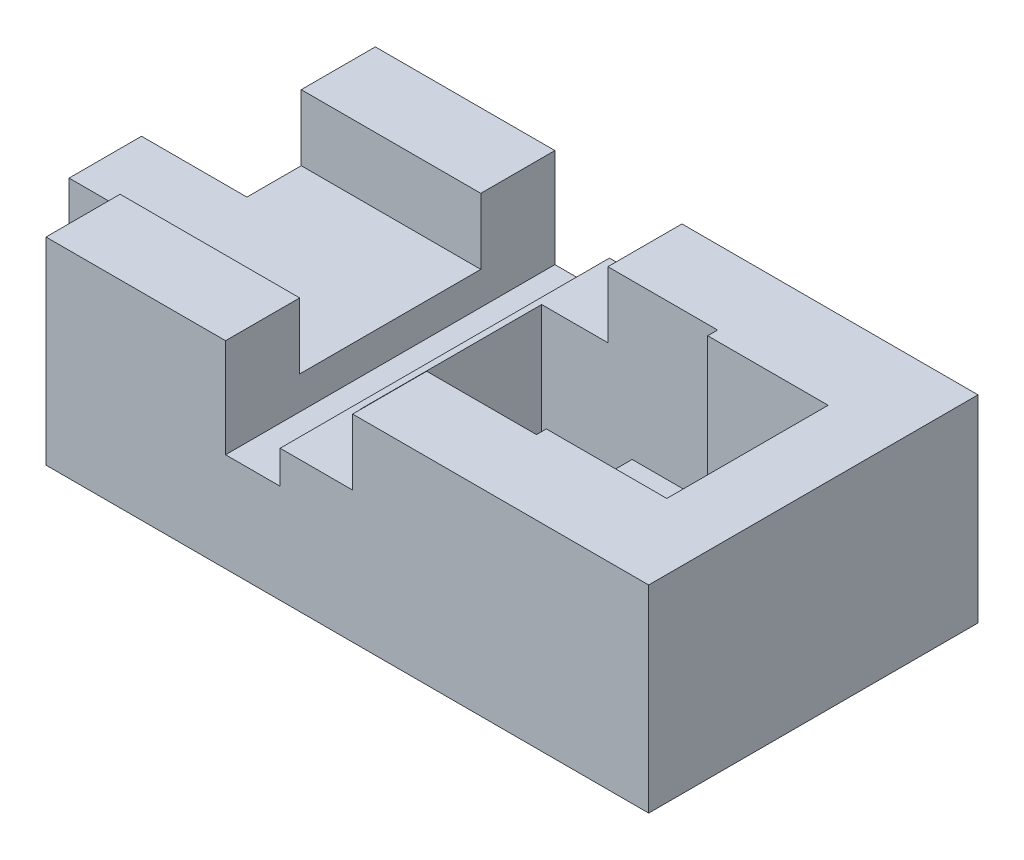
ISO-10303-21;
HEADER;
FILE_DESCRIPTION(('STEP AP214'),'2;1');
FILE_NAME('part.step','',(''),(''),'','','');
FILE_SCHEMA(('AUTOMOTIVE_DESIGN { 1 0 10303 214 1 1 1 1 }'));
ENDSEC;
DATA;
#1=APPLICATION_CONTEXT('core data for automotive mechanical design processes');
#2=APPLICATION_PROTOCOL_DEFINITION('international standard','automotive_design',2000,#1);
#3=PRODUCT_CONTEXT('',#1,'mechanical');
#4=PRODUCT('Part','Part','',(#3));
#5=PRODUCT_RELATED_PRODUCT_CATEGORY('part','',(#4));
#6=PRODUCT_DEFINITION_FORMATION('','',#4);
#7=PRODUCT_DEFINITION_CONTEXT('part definition',#1,'design');
#8=PRODUCT_DEFINITION('design','',#6,#7);
#9=PRODUCT_DEFINITION_SHAPE('','',#8);
#10=(LENGTH_UNIT() NAMED_UNIT(*) SI_UNIT(.MILLI.,.METRE.));
#11=(NAMED_UNIT(*) PLANE_ANGLE_UNIT() SI_UNIT($,.RADIAN.));
#12=(NAMED_UNIT(*) SI_UNIT($,.STERADIAN.) SOLID_ANGLE_UNIT());
#13=UNCERTAINTY_MEASURE_WITH_UNIT(LENGTH_MEASURE(1.E-05),#10,'distance_accuracy_value','');
#14=(GEOMETRIC_REPRESENTATION_CONTEXT(3) GLOBAL_UNCERTAINTY_ASSIGNED_CONTEXT((#13)) GLOBAL_UNIT_ASSIGNED_CONTEXT((#10,
#11,#12)) REPRESENTATION_CONTEXT('',''));
#15=CARTESIAN_POINT('',(0.,0.,0.));
#16=DIRECTION('',(0.,0.,1.));
#17=DIRECTION('',(1.,0.,0.));
#18=AXIS2_PLACEMENT_3D('',#15,#16,#17);
#19=CARTESIAN_POINT('',(0.,4.,0.));
#20=DIRECTION('',(0.,-1.,0.));
#21=DIRECTION('',(0.,0.,-1.));
#22=AXIS2_PLACEMENT_3D('',#19,#20,#21);
#23=PLANE('',#22);
#24=DIRECTION('',(0.,0.,1.));
#25=VECTOR('',#24,1.);
#26=CARTESIAN_POINT('',(-1.09759037141544,4.,0.));
#27=LINE('',#26,#25);
#28=CARTESIAN_POINT('',(-1.09759037141544,4.,-2.75));
#29=VERTEX_POINT('',#28);
#30=CARTESIAN_POINT('',(-1.09759037141544,4.,2.75));
#31=VERTEX_POINT('',#30);
#32=EDGE_CURVE('E308',#29,#31,#27,.T.);
#33=ORIENTED_EDGE('',*,*,#32,.F.);
#34=DIRECTION('',(1.,0.,0.));
#35=VECTOR('',#34,1.);
#36=CARTESIAN_POINT('',(-6.55,4.,-2.75));
#37=LINE('',#36,#35);
#38=CARTESIAN_POINT('',(-6.55,4.,-2.75));
#39=VERTEX_POINT('',#38);
#40=EDGE_CURVE('E330',#39,#29,#37,.T.);
#41=ORIENTED_EDGE('',*,*,#40,.F.);
#42=DIRECTION('',(0.,0.,-1.));
#43=VECTOR('',#42,1.);
#44=CARTESIAN_POINT('',(-6.55,4.,-5.));
#45=LINE('',#44,#43);
#46=CARTESIAN_POINT('',(-6.55,4.,-1.1));
#47=VERTEX_POINT('',#46);
#48=EDGE_CURVE('E528',#47,#39,#45,.T.);
#49=ORIENTED_EDGE('',*,*,#48,.F.);
#50=DIRECTION('',(1.,0.,0.));
#51=VECTOR('',#50,1.);
#52=CARTESIAN_POINT('',(-9.75,4.,-1.1));
#53=LINE('',#52,#51);
#54=CARTESIAN_POINT('',(-9.75,4.,-1.1));
#55=VERTEX_POINT('',#54);
#56=EDGE_CURVE('E533',#55,#47,#53,.T.);
#57=ORIENTED_EDGE('',*,*,#56,.F.);
#58=DIRECTION('',(0.,0.,1.));
#59=VECTOR('',#58,1.);
#60=CARTESIAN_POINT('',(-9.75,4.,5.));
#61=LINE('',#60,#59);
#62=CARTESIAN_POINT('',(-9.75,4.,1.1));
#63=VERTEX_POINT('',#62);
#64=EDGE_CURVE('E602',#55,#63,#61,.T.);
#65=ORIENTED_EDGE('',*,*,#64,.T.);
#66=DIRECTION('',(-1.,0.,0.));
#67=VECTOR('',#66,1.);
#68=CARTESIAN_POINT('',(-9.75,4.,1.1));
#69=LINE('',#68,#67);
#70=CARTESIAN_POINT('',(-6.55,4.,1.1));
#71=VERTEX_POINT('',#70);
#72=EDGE_CURVE('E561',#71,#63,#69,.T.);
#73=ORIENTED_EDGE('',*,*,#72,.F.);
#74=DIRECTION('',(0.,0.,-1.));
#75=VECTOR('',#74,1.);
#76=CARTESIAN_POINT('',(-6.55,4.,5.));
#77=LINE('',#76,#75);
#78=CARTESIAN_POINT('',(-6.55,4.,2.75));
#79=VERTEX_POINT('',#78);
#80=EDGE_CURVE('E537',#79,#71,#77,.T.);
#81=ORIENTED_EDGE('',*,*,#80,.F.);
#82=DIRECTION('',(-1.,0.,0.));
#83=VECTOR('',#82,1.);
#84=CARTESIAN_POINT('',(-6.55,4.,2.75));
#85=LINE('',#84,#83);
#86=EDGE_CURVE('E73',#31,#79,#85,.T.);
#87=ORIENTED_EDGE('',*,*,#86,.F.);
#88=EDGE_LOOP('',(#33,#41,#49,#57,#65,#73,#81,#87));
#89=FACE_BOUND('',#88,.T.);
#90=ADVANCED_FACE('F48',(#89),#23,.F.);
#91=DIRECTION('',(0.,0.,-1.));
#92=VECTOR('',#91,1.);
#93=CARTESIAN_POINT('',(0.558934694694813,4.,0.));
#94=LINE('',#93,#92);
#95=CARTESIAN_POINT('',(0.558934694694813,4.,5.));
#96=VERTEX_POINT('',#95);
#97=CARTESIAN_POINT('',(0.558934694694813,4.,-5.));
#98=VERTEX_POINT('',#97);
#99=EDGE_CURVE('E311',#96,#98,#94,.T.);
#100=ORIENTED_EDGE('',*,*,#99,.F.);
#101=DIRECTION('',(1.,0.,0.));
#102=VECTOR('',#101,1.);
#103=CARTESIAN_POINT('',(-9.75,4.,5.));
#104=LINE('',#103,#102);
#105=CARTESIAN_POINT('',(2.7606994651137,4.,5.));
#106=VERTEX_POINT('',#105);
#107=EDGE_CURVE('E607',#96,#106,#104,.T.);
#108=ORIENTED_EDGE('',*,*,#107,.T.);
#109=DIRECTION('',(0.,0.,1.));
#110=VECTOR('',#109,1.);
#111=CARTESIAN_POINT('',(2.7606994651137,4.,5.));
#112=LINE('',#111,#110);
#113=CARTESIAN_POINT('',(2.7606994651137,4.,2.75));
#114=VERTEX_POINT('',#113);
#115=EDGE_CURVE('E424',#114,#106,#112,.T.);
#116=ORIENTED_EDGE('',*,*,#115,.F.);
#117=DIRECTION('',(1.,0.,0.));
#118=VECTOR('',#117,1.);
#119=CARTESIAN_POINT('',(9.75,4.,2.75));
#120=LINE('',#119,#118);
#121=CARTESIAN_POINT('',(0.750000000000002,4.,2.75));
#122=VERTEX_POINT('',#121);
#123=EDGE_CURVE('E577',#122,#114,#120,.T.);
#124=ORIENTED_EDGE('',*,*,#123,.F.);
#125=DIRECTION('',(0.,0.,1.));
#126=VECTOR('',#125,1.);
#127=CARTESIAN_POINT('',(0.750000000000002,4.,-2.75));
#128=LINE('',#127,#126);
#129=CARTESIAN_POINT('',(0.750000000000002,4.,-2.75));
#130=VERTEX_POINT('',#129);
#131=EDGE_CURVE('E584',#130,#122,#128,.T.);
#132=ORIENTED_EDGE('',*,*,#131,.F.);
#133=DIRECTION('',(-1.,0.,0.));
#134=VECTOR('',#133,1.);
#135=CARTESIAN_POINT('',(9.75,4.,-2.75));
#136=LINE('',#135,#134);
#137=CARTESIAN_POINT('',(2.7606994651137,4.,-2.75));
#138=VERTEX_POINT('',#137);
#139=EDGE_CURVE('E544',#138,#130,#136,.T.);
#140=ORIENTED_EDGE('',*,*,#139,.F.);
#141=DIRECTION('',(0.,0.,1.));
#142=VECTOR('',#141,1.);
#143=CARTESIAN_POINT('',(2.7606994651137,4.,-2.75));
#144=LINE('',#143,#142);
#145=CARTESIAN_POINT('',(2.7606994651137,4.,-5.));
#146=VERTEX_POINT('',#145);
#147=EDGE_CURVE('E430',#146,#138,#144,.T.);
#148=ORIENTED_EDGE('',*,*,#147,.F.);
#149=DIRECTION('',(-1.,0.,0.));
#150=VECTOR('',#149,1.);
#151=CARTESIAN_POINT('',(-9.75,4.,-5.));
#152=LINE('',#151,#150);
#153=EDGE_CURVE('E598',#146,#98,#152,.T.);
#154=ORIENTED_EDGE('',*,*,#153,.T.);
#155=EDGE_LOOP('',(#100,#108,#116,#124,#132,#140,#148,#154));
#156=FACE_BOUND('',#155,.T.);
#157=ADVANCED_FACE('F679',(#156),#23,.F.);
#158=CARTESIAN_POINT('',(-9.75,4.,-5.));
#159=DIRECTION('',(0.,0.,1.));
#160=DIRECTION('',(1.,0.,0.));
#161=AXIS2_PLACEMENT_3D('',#158,#159,#160);
#162=PLANE('',#161);
#163=DIRECTION('',(0.,-1.,0.));
#164=VECTOR('',#163,1.);
#165=CARTESIAN_POINT('',(-1.09759037141544,7.8,-5.));
#166=LINE('',#165,#164);
#167=CARTESIAN_POINT('',(-1.09759037141544,6.,-5.));
#168=VERTEX_POINT('',#167);
#169=CARTESIAN_POINT('',(-1.09759037141544,3.,-5.));
#170=VERTEX_POINT('',#169);
#171=EDGE_CURVE('E65',#168,#170,#166,.T.);
#172=ORIENTED_EDGE('',*,*,#171,.T.);
#173=DIRECTION('',(-1.,0.,0.));
#174=VECTOR('',#173,1.);
#175=CARTESIAN_POINT('',(-1.09759037141544,3.,-5.));
#176=LINE('',#175,#174);
#177=CARTESIAN_POINT('',(0.558934694694813,3.,-5.));
#178=VERTEX_POINT('',#177);
#179=EDGE_CURVE('E286',#178,#170,#176,.T.);
#180=ORIENTED_EDGE('',*,*,#179,.F.);
#181=DIRECTION('',(0.,-1.,0.));
#182=VECTOR('',#181,1.);
#183=CARTESIAN_POINT('',(0.558934694694813,7.8,-5.));
#184=LINE('',#183,#182);
#185=EDGE_CURVE('E302',#98,#178,#184,.T.);
#186=ORIENTED_EDGE('',*,*,#185,.F.);
#187=ORIENTED_EDGE('',*,*,#153,.F.);
#188=DIRECTION('',(0.,-1.,0.));
#189=VECTOR('',#188,1.);
#190=CARTESIAN_POINT('',(2.7606994651137,6.,-5.));
#191=LINE('',#190,#189);
#192=CARTESIAN_POINT('',(2.7606994651137,6.,-5.));
#193=VERTEX_POINT('',#192);
#194=EDGE_CURVE('E464',#193,#146,#191,.T.);
#195=ORIENTED_EDGE('',*,*,#194,.F.);
#196=DIRECTION('',(-1.,0.,0.));
#197=VECTOR('',#196,1.);
#198=CARTESIAN_POINT('',(2.7606994651137,6.,-5.));
#199=LINE('',#198,#197);
#200=CARTESIAN_POINT('',(11.75,6.,-5.));
#201=VERTEX_POINT('',#200);
#202=EDGE_CURVE('E448',#201,#193,#199,.T.);
#203=ORIENTED_EDGE('',*,*,#202,.F.);
#204=DIRECTION('',(0.,1.,0.));
#205=VECTOR('',#204,1.);
#206=CARTESIAN_POINT('',(11.75,0.,-5.));
#207=LINE('',#206,#205);
#208=CARTESIAN_POINT('',(11.75,0.,-5.));
#209=VERTEX_POINT('',#208);
#210=EDGE_CURVE('E484',#209,#201,#207,.T.);
#211=ORIENTED_EDGE('',*,*,#210,.F.);
#212=DIRECTION('',(-1.,0.,0.));
#213=VECTOR('',#212,1.);
#214=CARTESIAN_POINT('',(-9.75,0.,-5.));
#215=LINE('',#214,#213);
#216=CARTESIAN_POINT('',(-6.55,0.,-5.));
#217=VERTEX_POINT('',#216);
#218=EDGE_CURVE('E594',#209,#217,#215,.T.);
#219=ORIENTED_EDGE('',*,*,#218,.T.);
#220=DIRECTION('',(0.,1.,0.));
#221=VECTOR('',#220,1.);
#222=CARTESIAN_POINT('',(-6.55,0.,-5.));
#223=LINE('',#222,#221);
#224=CARTESIAN_POINT('',(-6.55,6.,-5.));
#225=VERTEX_POINT('',#224);
#226=EDGE_CURVE('E541',#217,#225,#223,.T.);
#227=ORIENTED_EDGE('',*,*,#226,.T.);
#228=DIRECTION('',(1.,0.,0.));
#229=VECTOR('',#228,1.);
#230=CARTESIAN_POINT('',(-6.55,6.,-5.));
#231=LINE('',#230,#229);
#232=EDGE_CURVE('E343',#225,#168,#231,.T.);
#233=ORIENTED_EDGE('',*,*,#232,.T.);
#234=EDGE_LOOP('',(#172,#180,#186,#187,#195,#203,#211,#219,#227,#233));
#235=FACE_BOUND('',#234,.T.);
#236=ADVANCED_FACE('F683',(#235),#162,.F.);
#237=CARTESIAN_POINT('',(-9.75,4.,5.));
#238=DIRECTION('',(0.,0.,-1.));
#239=DIRECTION('',(-1.,0.,0.));
#240=AXIS2_PLACEMENT_3D('',#237,#238,#239);
#241=PLANE('',#240);
#242=DIRECTION('',(1.,0.,0.));
#243=VECTOR('',#242,1.);
#244=CARTESIAN_POINT('',(-1.09759037141544,3.,5.));
#245=LINE('',#244,#243);
#246=CARTESIAN_POINT('',(-1.09759037141544,3.,5.));
#247=VERTEX_POINT('',#246);
#248=CARTESIAN_POINT('',(0.558934694694813,3.,5.));
#249=VERTEX_POINT('',#248);
#250=EDGE_CURVE('E283',#247,#249,#245,.T.);
#251=ORIENTED_EDGE('',*,*,#250,.F.);
#252=DIRECTION('',(0.,-1.,0.));
#253=VECTOR('',#252,1.);
#254=CARTESIAN_POINT('',(-1.09759037141544,12.2350932135096,5.));
#255=LINE('',#254,#253);
#256=CARTESIAN_POINT('',(-1.09759037141544,6.,5.));
#257=VERTEX_POINT('',#256);
#258=EDGE_CURVE('E265',#257,#247,#255,.T.);
#259=ORIENTED_EDGE('',*,*,#258,.F.);
#260=DIRECTION('',(-1.,0.,0.));
#261=VECTOR('',#260,1.);
#262=CARTESIAN_POINT('',(-6.55,6.,5.));
#263=LINE('',#262,#261);
#264=CARTESIAN_POINT('',(-6.55,6.,5.));
#265=VERTEX_POINT('',#264);
#266=EDGE_CURVE('E334',#257,#265,#263,.T.);
#267=ORIENTED_EDGE('',*,*,#266,.T.);
#268=DIRECTION('',(0.,1.,0.));
#269=VECTOR('',#268,1.);
#270=CARTESIAN_POINT('',(-6.55,0.,5.));
#271=LINE('',#270,#269);
#272=CARTESIAN_POINT('',(-6.55,0.,5.));
#273=VERTEX_POINT('',#272);
#274=EDGE_CURVE('E550',#273,#265,#271,.T.);
#275=ORIENTED_EDGE('',*,*,#274,.F.);
#276=DIRECTION('',(1.,0.,0.));
#277=VECTOR('',#276,1.);
#278=CARTESIAN_POINT('',(-9.75,0.,5.));
#279=LINE('',#278,#277);
#280=CARTESIAN_POINT('',(11.75,0.,5.));
#281=VERTEX_POINT('',#280);
#282=EDGE_CURVE('E603',#273,#281,#279,.T.);
#283=ORIENTED_EDGE('',*,*,#282,.T.);
#284=DIRECTION('',(0.,-1.,0.));
#285=VECTOR('',#284,1.);
#286=CARTESIAN_POINT('',(11.75,0.,5.));
#287=LINE('',#286,#285);
#288=CARTESIAN_POINT('',(11.75,6.,5.));
#289=VERTEX_POINT('',#288);
#290=EDGE_CURVE('E490',#289,#281,#287,.T.);
#291=ORIENTED_EDGE('',*,*,#290,.F.);
#292=DIRECTION('',(1.,0.,0.));
#293=VECTOR('',#292,1.);
#294=CARTESIAN_POINT('',(11.75,6.,5.));
#295=LINE('',#294,#293);
#296=CARTESIAN_POINT('',(2.7606994651137,6.,5.));
#297=VERTEX_POINT('',#296);
#298=EDGE_CURVE('E440',#297,#289,#295,.T.);
#299=ORIENTED_EDGE('',*,*,#298,.F.);
#300=DIRECTION('',(0.,-1.,0.));
#301=VECTOR('',#300,1.);
#302=CARTESIAN_POINT('',(2.7606994651137,6.,5.));
#303=LINE('',#302,#301);
#304=EDGE_CURVE('E468',#297,#106,#303,.T.);
#305=ORIENTED_EDGE('',*,*,#304,.T.);
#306=ORIENTED_EDGE('',*,*,#107,.F.);
#307=DIRECTION('',(0.,-1.,0.));
#308=VECTOR('',#307,1.);
#309=CARTESIAN_POINT('',(0.558934694694813,7.8,5.));
#310=LINE('',#309,#308);
#311=EDGE_CURVE('E291',#96,#249,#310,.T.);
#312=ORIENTED_EDGE('',*,*,#311,.T.);
#313=EDGE_LOOP('',(#251,#259,#267,#275,#283,#291,#299,#305,#306,#312));
#314=FACE_BOUND('',#313,.T.);
#315=ADVANCED_FACE('F289',(#314),#241,.F.);
#316=CARTESIAN_POINT('',(-6.55,12.2350932135096,-2.75));
#317=DIRECTION('',(0.,0.,-1.));
#318=DIRECTION('',(-1.,0.,0.));
#319=AXIS2_PLACEMENT_3D('',#316,#317,#318);
#320=PLANE('',#319);
#321=DIRECTION('',(0.,-1.,0.));
#322=VECTOR('',#321,1.);
#323=CARTESIAN_POINT('',(-1.09759037141544,12.2350932135096,-2.75));
#324=LINE('',#323,#322);
#325=CARTESIAN_POINT('',(-1.09759037141544,6.,-2.75));
#326=VERTEX_POINT('',#325);
#327=EDGE_CURVE('E312',#326,#29,#324,.T.);
#328=ORIENTED_EDGE('',*,*,#327,.F.);
#329=DIRECTION('',(-1.,0.,0.));
#330=VECTOR('',#329,1.);
#331=CARTESIAN_POINT('',(-6.55,6.,-2.75));
#332=LINE('',#331,#330);
#333=CARTESIAN_POINT('',(-6.55,6.,-2.75));
#334=VERTEX_POINT('',#333);
#335=EDGE_CURVE('E339',#326,#334,#332,.T.);
#336=ORIENTED_EDGE('',*,*,#335,.T.);
#337=DIRECTION('',(0.,-1.,0.));
#338=VECTOR('',#337,1.);
#339=CARTESIAN_POINT('',(-6.55,12.2350932135096,-2.75));
#340=LINE('',#339,#338);
#341=EDGE_CURVE('E351',#334,#39,#340,.T.);
#342=ORIENTED_EDGE('',*,*,#341,.T.);
#343=ORIENTED_EDGE('',*,*,#40,.T.);
#344=EDGE_LOOP('',(#328,#336,#342,#343));
#345=FACE_BOUND('',#344,.T.);
#346=ADVANCED_FACE('F731',(#345),#320,.F.);
#347=CARTESIAN_POINT('',(0.,6.,0.));
#348=DIRECTION('',(0.,-1.,0.));
#349=DIRECTION('',(0.,0.,-1.));
#350=AXIS2_PLACEMENT_3D('',#347,#348,#349);
#351=PLANE('',#350);
#352=DIRECTION('',(0.,0.,1.));
#353=VECTOR('',#352,1.);
#354=CARTESIAN_POINT('',(-1.09759037141544,6.,0.));
#355=LINE('',#354,#353);
#356=EDGE_CURVE('E307',#168,#326,#355,.T.);
#357=ORIENTED_EDGE('',*,*,#356,.F.);
#358=ORIENTED_EDGE('',*,*,#232,.F.);
#359=DIRECTION('',(0.,0.,-1.));
#360=VECTOR('',#359,1.);
#361=CARTESIAN_POINT('',(-6.55,6.,-5.));
#362=LINE('',#361,#360);
#363=EDGE_CURVE('E342',#334,#225,#362,.T.);
#364=ORIENTED_EDGE('',*,*,#363,.F.);
#365=ORIENTED_EDGE('',*,*,#335,.F.);
#366=EDGE_LOOP('',(#357,#358,#364,#365));
#367=FACE_BOUND('',#366,.T.);
#368=ADVANCED_FACE('F750',(#367),#351,.F.);
#369=CARTESIAN_POINT('',(9.75,1.3,2.75));
#370=DIRECTION('',(0.,0.,1.));
#371=DIRECTION('',(1.,0.,0.));
#372=AXIS2_PLACEMENT_3D('',#369,#370,#371);
#373=PLANE('',#372);
#374=DIRECTION('',(-1.,0.,0.));
#375=VECTOR('',#374,1.);
#376=CARTESIAN_POINT('',(2.7606994651137,6.,2.75));
#377=LINE('',#376,#375);
#378=CARTESIAN_POINT('',(6.09259643383098,6.,2.75));
#379=VERTEX_POINT('',#378);
#380=CARTESIAN_POINT('',(2.7606994651137,6.,2.75));
#381=VERTEX_POINT('',#380);
#382=EDGE_CURVE('E434',#379,#381,#377,.T.);
#383=ORIENTED_EDGE('',*,*,#382,.F.);
#384=DIRECTION('',(0.,1.,0.));
#385=VECTOR('',#384,1.);
#386=CARTESIAN_POINT('',(6.09259643383098,0.,2.75));
#387=LINE('',#386,#385);
#388=CARTESIAN_POINT('',(6.09259643383098,1.3,2.75));
#389=VERTEX_POINT('',#388);
#390=EDGE_CURVE('E347',#389,#379,#387,.T.);
#391=ORIENTED_EDGE('',*,*,#390,.F.);
#392=DIRECTION('',(1.,0.,0.));
#393=VECTOR('',#392,1.);
#394=CARTESIAN_POINT('',(9.75,1.3,2.75));
#395=LINE('',#394,#393);
#396=CARTESIAN_POINT('',(3.49790103791758,1.3,2.75));
#397=VERTEX_POINT('',#396);
#398=EDGE_CURVE('E576',#397,#389,#395,.T.);
#399=ORIENTED_EDGE('',*,*,#398,.F.);
#400=DIRECTION('',(0.707106781186547,0.707106781186547,0.));
#401=VECTOR('',#400,1.);
#402=CARTESIAN_POINT('',(6.62395051895879,4.42604948104121,2.75));
#403=LINE('',#402,#401);
#404=CARTESIAN_POINT('',(2.49790103791758,0.299999999999999,2.75));
#405=VERTEX_POINT('',#404);
#406=EDGE_CURVE('E11',#397,#405,#403,.F.);
#407=ORIENTED_EDGE('',*,*,#406,.T.);
#408=DIRECTION('',(0.,1.,0.));
#409=VECTOR('',#408,1.);
#410=CARTESIAN_POINT('',(2.49790103791758,0.,2.75));
#411=LINE('',#410,#409);
#412=CARTESIAN_POINT('',(2.49790103791758,0.,2.75));
#413=VERTEX_POINT('',#412);
#414=EDGE_CURVE('E514',#413,#405,#411,.T.);
#415=ORIENTED_EDGE('',*,*,#414,.F.);
#416=DIRECTION('',(1.,0.,0.));
#417=VECTOR('',#416,1.);
#418=CARTESIAN_POINT('',(0.750000000000003,0.,2.75));
#419=LINE('',#418,#417);
#420=CARTESIAN_POINT('',(0.750000000000003,0.,2.75));
#421=VERTEX_POINT('',#420);
#422=EDGE_CURVE('E502',#421,#413,#419,.T.);
#423=ORIENTED_EDGE('',*,*,#422,.F.);
#424=DIRECTION('',(0.,1.,0.));
#425=VECTOR('',#424,1.);
#426=CARTESIAN_POINT('',(0.750000000000002,1.3,2.75));
#427=LINE('',#426,#425);
#428=EDGE_CURVE('E591',#421,#122,#427,.T.);
#429=ORIENTED_EDGE('',*,*,#428,.T.);
#430=ORIENTED_EDGE('',*,*,#123,.T.);
#431=DIRECTION('',(0.,-1.,0.));
#432=VECTOR('',#431,1.);
#433=CARTESIAN_POINT('',(2.7606994651137,6.,2.75));
#434=LINE('',#433,#432);
#435=EDGE_CURVE('E472',#381,#114,#434,.T.);
#436=ORIENTED_EDGE('',*,*,#435,.F.);
#437=EDGE_LOOP('',(#383,#391,#399,#407,#415,#423,#429,#430,#436));
#438=FACE_BOUND('',#437,.T.);
#439=ADVANCED_FACE('F642',(#438),#373,.F.);
#440=CARTESIAN_POINT('',(9.75,1.3,-2.75));
#441=DIRECTION('',(0.,0.,-1.));
#442=DIRECTION('',(-1.,0.,0.));
#443=AXIS2_PLACEMENT_3D('',#440,#441,#442);
#444=PLANE('',#443);
#445=DIRECTION('',(-1.,0.,0.));
#446=VECTOR('',#445,1.);
#447=CARTESIAN_POINT('',(9.75,1.3,-2.75));
#448=LINE('',#447,#446);
#449=CARTESIAN_POINT('',(6.09259643383098,1.3,-2.75));
#450=VERTEX_POINT('',#449);
#451=CARTESIAN_POINT('',(3.49790103791758,1.3,-2.75));
#452=VERTEX_POINT('',#451);
#453=EDGE_CURVE('E573',#450,#452,#448,.T.);
#454=ORIENTED_EDGE('',*,*,#453,.F.);
#455=DIRECTION('',(0.,1.,0.));
#456=VECTOR('',#455,1.);
#457=CARTESIAN_POINT('',(6.09259643383098,0.,-2.75));
#458=LINE('',#457,#456);
#459=CARTESIAN_POINT('',(6.09259643383098,6.,-2.75));
#460=VERTEX_POINT('',#459);
#461=EDGE_CURVE('E397',#450,#460,#458,.T.);
#462=ORIENTED_EDGE('',*,*,#461,.T.);
#463=DIRECTION('',(1.,0.,0.));
#464=VECTOR('',#463,1.);
#465=CARTESIAN_POINT('',(9.75,6.,-2.75));
#466=LINE('',#465,#464);
#467=CARTESIAN_POINT('',(2.7606994651137,6.,-2.75));
#468=VERTEX_POINT('',#467);
#469=EDGE_CURVE('E425',#468,#460,#466,.T.);
#470=ORIENTED_EDGE('',*,*,#469,.F.);
#471=DIRECTION('',(0.,-1.,0.));
#472=VECTOR('',#471,1.);
#473=CARTESIAN_POINT('',(2.7606994651137,6.,-2.75));
#474=LINE('',#473,#472);
#475=EDGE_CURVE('E454',#468,#138,#474,.T.);
#476=ORIENTED_EDGE('',*,*,#475,.T.);
#477=ORIENTED_EDGE('',*,*,#139,.T.);
#478=DIRECTION('',(0.,1.,0.));
#479=VECTOR('',#478,1.);
#480=CARTESIAN_POINT('',(0.750000000000002,1.3,-2.75));
#481=LINE('',#480,#479);
#482=CARTESIAN_POINT('',(0.750000000000002,0.,-2.75));
#483=VERTEX_POINT('',#482);
#484=EDGE_CURVE('E581',#483,#130,#481,.T.);
#485=ORIENTED_EDGE('',*,*,#484,.F.);
#486=DIRECTION('',(-1.,0.,0.));
#487=VECTOR('',#486,1.);
#488=CARTESIAN_POINT('',(0.750000000000002,0.,-2.75));
#489=LINE('',#488,#487);
#490=CARTESIAN_POINT('',(2.49790103791758,0.,-2.75));
#491=VERTEX_POINT('',#490);
#492=EDGE_CURVE('E510',#491,#483,#489,.T.);
#493=ORIENTED_EDGE('',*,*,#492,.F.);
#494=DIRECTION('',(0.,1.,0.));
#495=VECTOR('',#494,1.);
#496=CARTESIAN_POINT('',(2.49790103791758,0.,-2.75));
#497=LINE('',#496,#495);
#498=CARTESIAN_POINT('',(2.49790103791758,0.299999999999999,-2.75));
#499=VERTEX_POINT('',#498);
#500=EDGE_CURVE('E515',#491,#499,#497,.T.);
#501=ORIENTED_EDGE('',*,*,#500,.T.);
#502=DIRECTION('',(-0.707106781186547,-0.707106781186547,0.));
#503=VECTOR('',#502,1.);
#504=CARTESIAN_POINT('',(6.62395051895879,4.42604948104121,-2.75));
#505=LINE('',#504,#503);
#506=EDGE_CURVE('E58',#499,#452,#505,.F.);
#507=ORIENTED_EDGE('',*,*,#506,.T.);
#508=EDGE_LOOP('',(#454,#462,#470,#476,#477,#485,#493,#501,#507));
#509=FACE_BOUND('',#508,.T.);
#510=ADVANCED_FACE('F631',(#509),#444,.F.);
#511=CARTESIAN_POINT('',(0.,1.3,0.));
#512=DIRECTION('',(0.,-1.,0.));
#513=DIRECTION('',(0.,0.,-1.));
#514=AXIS2_PLACEMENT_3D('',#511,#512,#513);
#515=PLANE('',#514);
#516=ORIENTED_EDGE('',*,*,#398,.T.);
#517=DIRECTION('',(0.,0.,-1.));
#518=VECTOR('',#517,1.);
#519=CARTESIAN_POINT('',(6.09259643383098,1.3,0.));
#520=LINE('',#519,#518);
#521=CARTESIAN_POINT('',(6.09259643383098,1.3,2.45));
#522=VERTEX_POINT('',#521);
#523=EDGE_CURVE('E386',#389,#522,#520,.T.);
#524=ORIENTED_EDGE('',*,*,#523,.T.);
#525=DIRECTION('',(1.,0.,0.));
#526=VECTOR('',#525,1.);
#527=CARTESIAN_POINT('',(0.,1.3,2.45));
#528=LINE('',#527,#526);
#529=CARTESIAN_POINT('',(8.00292213727261,1.3,2.45));
#530=VERTEX_POINT('',#529);
#531=EDGE_CURVE('E382',#522,#530,#528,.T.);
#532=ORIENTED_EDGE('',*,*,#531,.T.);
#533=DIRECTION('',(0.,0.,1.));
#534=VECTOR('',#533,1.);
#535=CARTESIAN_POINT('',(8.00292213727261,1.3,-2.75));
#536=LINE('',#535,#534);
#537=CARTESIAN_POINT('',(8.00292213727261,1.3,-2.45));
#538=VERTEX_POINT('',#537);
#539=EDGE_CURVE('E476',#538,#530,#536,.T.);
#540=ORIENTED_EDGE('',*,*,#539,.F.);
#541=DIRECTION('',(-1.,0.,0.));
#542=VECTOR('',#541,1.);
#543=CARTESIAN_POINT('',(0.,1.3,-2.45));
#544=LINE('',#543,#542);
#545=CARTESIAN_POINT('',(6.09259643383098,1.3,-2.45));
#546=VERTEX_POINT('',#545);
#547=EDGE_CURVE('E420',#538,#546,#544,.T.);
#548=ORIENTED_EDGE('',*,*,#547,.T.);
#549=DIRECTION('',(0.,0.,-1.));
#550=VECTOR('',#549,1.);
#551=CARTESIAN_POINT('',(6.09259643383098,1.3,0.));
#552=LINE('',#551,#550);
#553=EDGE_CURVE('E402',#546,#450,#552,.T.);
#554=ORIENTED_EDGE('',*,*,#553,.T.);
#555=ORIENTED_EDGE('',*,*,#453,.T.);
#556=DIRECTION('',(0.,0.,1.));
#557=VECTOR('',#556,1.);
#558=CARTESIAN_POINT('',(3.49790103791758,1.3,0.));
#559=LINE('',#558,#557);
#560=EDGE_CURVE('E623',#452,#397,#559,.T.);
#561=ORIENTED_EDGE('',*,*,#560,.T.);
#562=EDGE_LOOP('',(#516,#524,#532,#540,#548,#554,#555,#561));
#563=FACE_BOUND('',#562,.T.);
#564=ADVANCED_FACE('F638',(#563),#515,.F.);
#565=CARTESIAN_POINT('',(9.75,0.,0.));
#566=DIRECTION('',(1.,0.,0.));
#567=DIRECTION('',(0.,0.,-1.));
#568=AXIS2_PLACEMENT_3D('',#565,#566,#567);
#569=PLANE('',#568);
#570=DIRECTION('',(0.,0.,-1.));
#571=VECTOR('',#570,1.);
#572=CARTESIAN_POINT('',(9.75,2.8,-2.75));
#573=LINE('',#572,#571);
#574=CARTESIAN_POINT('',(9.75,2.8,2.45));
#575=VERTEX_POINT('',#574);
#576=CARTESIAN_POINT('',(9.75,2.8,-2.45));
#577=VERTEX_POINT('',#576);
#578=EDGE_CURVE('E477',#575,#577,#573,.T.);
#579=ORIENTED_EDGE('',*,*,#578,.F.);
#580=DIRECTION('',(0.,1.,0.));
#581=VECTOR('',#580,1.);
#582=CARTESIAN_POINT('',(9.75,0.,2.45));
#583=LINE('',#582,#581);
#584=CARTESIAN_POINT('',(9.75,6.,2.45));
#585=VERTEX_POINT('',#584);
#586=EDGE_CURVE('E357',#575,#585,#583,.T.);
#587=ORIENTED_EDGE('',*,*,#586,.T.);
#588=DIRECTION('',(0.,0.,1.));
#589=VECTOR('',#588,1.);
#590=CARTESIAN_POINT('',(9.75,6.,2.75));
#591=LINE('',#590,#589);
#592=CARTESIAN_POINT('',(9.75,6.,-2.45));
#593=VERTEX_POINT('',#592);
#594=EDGE_CURVE('E429',#593,#585,#591,.T.);
#595=ORIENTED_EDGE('',*,*,#594,.F.);
#596=DIRECTION('',(0.,1.,0.));
#597=VECTOR('',#596,1.);
#598=CARTESIAN_POINT('',(9.75,0.,-2.45));
#599=LINE('',#598,#597);
#600=EDGE_CURVE('E398',#577,#593,#599,.T.);
#601=ORIENTED_EDGE('',*,*,#600,.F.);
#602=EDGE_LOOP('',(#579,#587,#595,#601));
#603=FACE_BOUND('',#602,.T.);
#604=ADVANCED_FACE('F663',(#603),#569,.F.);
#605=CARTESIAN_POINT('',(-9.75,4.,5.));
#606=DIRECTION('',(1.,0.,0.));
#607=DIRECTION('',(0.,0.,-1.));
#608=AXIS2_PLACEMENT_3D('',#605,#606,#607);
#609=PLANE('',#608);
#610=ORIENTED_EDGE('',*,*,#64,.F.);
#611=DIRECTION('',(0.,1.,0.));
#612=VECTOR('',#611,1.);
#613=CARTESIAN_POINT('',(-9.75,0.,-1.1));
#614=LINE('',#613,#612);
#615=CARTESIAN_POINT('',(-9.75,0.,-1.1));
#616=VERTEX_POINT('',#615);
#617=EDGE_CURVE('E532',#616,#55,#614,.T.);
#618=ORIENTED_EDGE('',*,*,#617,.F.);
#619=DIRECTION('',(0.,0.,1.));
#620=VECTOR('',#619,1.);
#621=CARTESIAN_POINT('',(-9.75,0.,5.));
#622=LINE('',#621,#620);
#623=CARTESIAN_POINT('',(-9.75,0.,1.1));
#624=VERTEX_POINT('',#623);
#625=EDGE_CURVE('E614',#616,#624,#622,.T.);
#626=ORIENTED_EDGE('',*,*,#625,.T.);
#627=DIRECTION('',(0.,1.,0.));
#628=VECTOR('',#627,1.);
#629=CARTESIAN_POINT('',(-9.75,0.,1.1));
#630=LINE('',#629,#628);
#631=EDGE_CURVE('E519',#624,#63,#630,.T.);
#632=ORIENTED_EDGE('',*,*,#631,.T.);
#633=EDGE_LOOP('',(#610,#618,#626,#632));
#634=FACE_BOUND('',#633,.T.);
#635=ADVANCED_FACE('F728',(#634),#609,.F.);
#636=CARTESIAN_POINT('',(0.,0.,0.));
#637=DIRECTION('',(0.,-1.,0.));
#638=DIRECTION('',(0.,0.,-1.));
#639=AXIS2_PLACEMENT_3D('',#636,#637,#638);
#640=PLANE('',#639);
#641=DIRECTION('',(0.,0.,1.));
#642=VECTOR('',#641,1.);
#643=CARTESIAN_POINT('',(0.750000000000002,0.,-2.75));
#644=LINE('',#643,#642);
#645=EDGE_CURVE('E498',#483,#421,#644,.T.);
#646=ORIENTED_EDGE('',*,*,#645,.T.);
#647=ORIENTED_EDGE('',*,*,#422,.T.);
#648=DIRECTION('',(0.,0.,-1.));
#649=VECTOR('',#648,1.);
#650=CARTESIAN_POINT('',(2.49790103791758,0.,-2.75));
#651=LINE('',#650,#649);
#652=EDGE_CURVE('E506',#413,#491,#651,.T.);
#653=ORIENTED_EDGE('',*,*,#652,.T.);
#654=ORIENTED_EDGE('',*,*,#492,.T.);
#655=EDGE_LOOP('',(#646,#647,#653,#654));
#656=FACE_BOUND('',#655,.T.);
#657=DIRECTION('',(0.,0.,-1.));
#658=VECTOR('',#657,1.);
#659=CARTESIAN_POINT('',(-6.55,0.,-5.));
#660=LINE('',#659,#658);
#661=CARTESIAN_POINT('',(-6.55,0.,-1.1));
#662=VERTEX_POINT('',#661);
#663=EDGE_CURVE('E527',#662,#217,#660,.T.);
#664=ORIENTED_EDGE('',*,*,#663,.T.);
#665=ORIENTED_EDGE('',*,*,#218,.F.);
#666=DIRECTION('',(0.,0.,-1.));
#667=VECTOR('',#666,1.);
#668=CARTESIAN_POINT('',(11.75,0.,-5.));
#669=LINE('',#668,#667);
#670=EDGE_CURVE('E494',#281,#209,#669,.T.);
#671=ORIENTED_EDGE('',*,*,#670,.F.);
#672=ORIENTED_EDGE('',*,*,#282,.F.);
#673=DIRECTION('',(0.,0.,-1.));
#674=VECTOR('',#673,1.);
#675=CARTESIAN_POINT('',(-6.55,0.,5.));
#676=LINE('',#675,#674);
#677=CARTESIAN_POINT('',(-6.55,0.,1.1));
#678=VERTEX_POINT('',#677);
#679=EDGE_CURVE('E564',#273,#678,#676,.T.);
#680=ORIENTED_EDGE('',*,*,#679,.T.);
#681=DIRECTION('',(-1.,0.,0.));
#682=VECTOR('',#681,1.);
#683=CARTESIAN_POINT('',(-9.75,0.,1.1));
#684=LINE('',#683,#682);
#685=EDGE_CURVE('E553',#678,#624,#684,.T.);
#686=ORIENTED_EDGE('',*,*,#685,.T.);
#687=ORIENTED_EDGE('',*,*,#625,.F.);
#688=DIRECTION('',(1.,0.,0.));
#689=VECTOR('',#688,1.);
#690=CARTESIAN_POINT('',(-9.75,0.,-1.1));
#691=LINE('',#690,#689);
#692=EDGE_CURVE('E523',#616,#662,#691,.T.);
#693=ORIENTED_EDGE('',*,*,#692,.T.);
#694=EDGE_LOOP('',(#664,#665,#671,#672,#680,#686,#687,#693));
#695=FACE_BOUND('',#694,.T.);
#696=ADVANCED_FACE('F698',(#656,#695),#640,.T.);
#697=CARTESIAN_POINT('',(0.750000000000002,1.3,-2.75));
#698=DIRECTION('',(-1.,0.,0.));
#699=DIRECTION('',(0.,0.,1.));
#700=AXIS2_PLACEMENT_3D('',#697,#698,#699);
#701=PLANE('',#700);
#702=ORIENTED_EDGE('',*,*,#131,.T.);
#703=ORIENTED_EDGE('',*,*,#428,.F.);
#704=ORIENTED_EDGE('',*,*,#645,.F.);
#705=ORIENTED_EDGE('',*,*,#484,.T.);
#706=EDGE_LOOP('',(#702,#703,#704,#705));
#707=FACE_BOUND('',#706,.T.);
#708=ADVANCED_FACE('F696',(#707),#701,.F.);
#709=CARTESIAN_POINT('',(-9.75,0.,1.1));
#710=DIRECTION('',(0.,0.,-1.));
#711=DIRECTION('',(-1.,0.,0.));
#712=AXIS2_PLACEMENT_3D('',#709,#710,#711);
#713=PLANE('',#712);
#714=ORIENTED_EDGE('',*,*,#72,.T.);
#715=ORIENTED_EDGE('',*,*,#631,.F.);
#716=ORIENTED_EDGE('',*,*,#685,.F.);
#717=DIRECTION('',(0.,1.,0.));
#718=VECTOR('',#717,1.);
#719=CARTESIAN_POINT('',(-6.55,0.,1.1));
#720=LINE('',#719,#718);
#721=EDGE_CURVE('E554',#678,#71,#720,.T.);
#722=ORIENTED_EDGE('',*,*,#721,.T.);
#723=EDGE_LOOP('',(#714,#715,#716,#722));
#724=FACE_BOUND('',#723,.T.);
#725=ADVANCED_FACE('F892',(#724),#713,.F.);
#726=CARTESIAN_POINT('',(-6.55,0.,5.));
#727=DIRECTION('',(1.,0.,0.));
#728=DIRECTION('',(0.,0.,-1.));
#729=AXIS2_PLACEMENT_3D('',#726,#727,#728);
#730=PLANE('',#729);
#731=ORIENTED_EDGE('',*,*,#274,.T.);
#732=DIRECTION('',(0.,0.,-1.));
#733=VECTOR('',#732,1.);
#734=CARTESIAN_POINT('',(-6.55,6.,5.));
#735=LINE('',#734,#733);
#736=CARTESIAN_POINT('',(-6.55,6.,2.75));
#737=VERTEX_POINT('',#736);
#738=EDGE_CURVE('E319',#265,#737,#735,.T.);
#739=ORIENTED_EDGE('',*,*,#738,.T.);
#740=DIRECTION('',(0.,-1.,0.));
#741=VECTOR('',#740,1.);
#742=CARTESIAN_POINT('',(-6.55,12.2350932135096,2.75));
#743=LINE('',#742,#741);
#744=EDGE_CURVE('E325',#737,#79,#743,.T.);
#745=ORIENTED_EDGE('',*,*,#744,.T.);
#746=ORIENTED_EDGE('',*,*,#80,.T.);
#747=ORIENTED_EDGE('',*,*,#721,.F.);
#748=ORIENTED_EDGE('',*,*,#679,.F.);
#749=EDGE_LOOP('',(#731,#739,#745,#746,#747,#748));
#750=FACE_BOUND('',#749,.T.);
#751=ADVANCED_FACE('F878',(#750),#730,.F.);
#752=CARTESIAN_POINT('',(-6.55,0.,-5.));
#753=DIRECTION('',(1.,0.,0.));
#754=DIRECTION('',(0.,0.,-1.));
#755=AXIS2_PLACEMENT_3D('',#752,#753,#754);
#756=PLANE('',#755);
#757=ORIENTED_EDGE('',*,*,#48,.T.);
#758=ORIENTED_EDGE('',*,*,#341,.F.);
#759=ORIENTED_EDGE('',*,*,#363,.T.);
#760=ORIENTED_EDGE('',*,*,#226,.F.);
#761=ORIENTED_EDGE('',*,*,#663,.F.);
#762=DIRECTION('',(0.,1.,0.));
#763=VECTOR('',#762,1.);
#764=CARTESIAN_POINT('',(-6.55,0.,-1.1));
#765=LINE('',#764,#763);
#766=EDGE_CURVE('E545',#662,#47,#765,.T.);
#767=ORIENTED_EDGE('',*,*,#766,.T.);
#768=EDGE_LOOP('',(#757,#758,#759,#760,#761,#767));
#769=FACE_BOUND('',#768,.T.);
#770=ADVANCED_FACE('F710',(#769),#756,.F.);
#771=CARTESIAN_POINT('',(-9.75,0.,-1.1));
#772=DIRECTION('',(0.,0.,1.));
#773=DIRECTION('',(1.,0.,0.));
#774=AXIS2_PLACEMENT_3D('',#771,#772,#773);
#775=PLANE('',#774);
#776=ORIENTED_EDGE('',*,*,#56,.T.);
#777=ORIENTED_EDGE('',*,*,#766,.F.);
#778=ORIENTED_EDGE('',*,*,#692,.F.);
#779=ORIENTED_EDGE('',*,*,#617,.T.);
#780=EDGE_LOOP('',(#776,#777,#778,#779));
#781=FACE_BOUND('',#780,.T.);
#782=ADVANCED_FACE('F703',(#781),#775,.F.);
#783=CARTESIAN_POINT('',(2.49790103791758,0.,-2.75));
#784=DIRECTION('',(1.,0.,0.));
#785=DIRECTION('',(0.,0.,-1.));
#786=AXIS2_PLACEMENT_3D('',#783,#784,#785);
#787=PLANE('',#786);
#788=ORIENTED_EDGE('',*,*,#414,.T.);
#789=DIRECTION('',(0.,0.,-1.));
#790=VECTOR('',#789,1.);
#791=CARTESIAN_POINT('',(2.49790103791758,0.299999999999999,-2.75));
#792=LINE('',#791,#790);
#793=EDGE_CURVE('E610',#405,#499,#792,.T.);
#794=ORIENTED_EDGE('',*,*,#793,.T.);
#795=ORIENTED_EDGE('',*,*,#500,.F.);
#796=ORIENTED_EDGE('',*,*,#652,.F.);
#797=EDGE_LOOP('',(#788,#794,#795,#796));
#798=FACE_BOUND('',#797,.T.);
#799=ADVANCED_FACE('F701',(#798),#787,.F.);
#800=CARTESIAN_POINT('',(2.49790103791758,0.299999999999999,-2.75));
#801=DIRECTION('',(0.707106781186547,-0.707106781186547,0.));
#802=DIRECTION('',(0.,0.,-1.));
#803=AXIS2_PLACEMENT_3D('',#800,#801,#802);
#804=PLANE('',#803);
#805=ORIENTED_EDGE('',*,*,#406,.F.);
#806=ORIENTED_EDGE('',*,*,#560,.F.);
#807=ORIENTED_EDGE('',*,*,#506,.F.);
#808=ORIENTED_EDGE('',*,*,#793,.F.);
#809=EDGE_LOOP('',(#805,#806,#807,#808));
#810=FACE_BOUND('',#809,.T.);
#811=ADVANCED_FACE('F51',(#810),#804,.F.);
#812=CARTESIAN_POINT('',(11.75,0.,0.));
#813=DIRECTION('',(1.,0.,0.));
#814=DIRECTION('',(0.,0.,-1.));
#815=AXIS2_PLACEMENT_3D('',#812,#813,#814);
#816=PLANE('',#815);
#817=ORIENTED_EDGE('',*,*,#210,.T.);
#818=DIRECTION('',(0.,0.,-1.));
#819=VECTOR('',#818,1.);
#820=CARTESIAN_POINT('',(11.75,6.,-5.));
#821=LINE('',#820,#819);
#822=EDGE_CURVE('E444',#289,#201,#821,.T.);
#823=ORIENTED_EDGE('',*,*,#822,.F.);
#824=ORIENTED_EDGE('',*,*,#290,.T.);
#825=ORIENTED_EDGE('',*,*,#670,.T.);
#826=EDGE_LOOP('',(#817,#823,#824,#825));
#827=FACE_BOUND('',#826,.T.);
#828=ADVANCED_FACE('F709',(#827),#816,.T.);
#829=CARTESIAN_POINT('',(8.00292213727261,2.8,-2.75));
#830=DIRECTION('',(1.,0.,0.));
#831=DIRECTION('',(0.,0.,-1.));
#832=AXIS2_PLACEMENT_3D('',#829,#830,#831);
#833=PLANE('',#832);
#834=ORIENTED_EDGE('',*,*,#539,.T.);
#835=DIRECTION('',(0.,1.,0.));
#836=VECTOR('',#835,1.);
#837=CARTESIAN_POINT('',(8.00292213727261,2.8,2.45));
#838=LINE('',#837,#836);
#839=CARTESIAN_POINT('',(8.00292213727261,2.8,2.45));
#840=VERTEX_POINT('',#839);
#841=EDGE_CURVE('E378',#530,#840,#838,.T.);
#842=ORIENTED_EDGE('',*,*,#841,.T.);
#843=DIRECTION('',(0.,0.,1.));
#844=VECTOR('',#843,1.);
#845=CARTESIAN_POINT('',(8.00292213727261,2.8,-2.75));
#846=LINE('',#845,#844);
#847=CARTESIAN_POINT('',(8.00292213727261,2.8,-2.45));
#848=VERTEX_POINT('',#847);
#849=EDGE_CURVE('E480',#848,#840,#846,.T.);
#850=ORIENTED_EDGE('',*,*,#849,.F.);
#851=DIRECTION('',(0.,-1.,0.));
#852=VECTOR('',#851,1.);
#853=CARTESIAN_POINT('',(8.00292213727261,2.8,-2.45));
#854=LINE('',#853,#852);
#855=EDGE_CURVE('E416',#848,#538,#854,.T.);
#856=ORIENTED_EDGE('',*,*,#855,.T.);
#857=EDGE_LOOP('',(#834,#842,#850,#856));
#858=FACE_BOUND('',#857,.T.);
#859=ADVANCED_FACE('F652',(#858),#833,.F.);
#860=CARTESIAN_POINT('',(0.,2.8,0.));
#861=DIRECTION('',(0.,-1.,0.));
#862=DIRECTION('',(0.,0.,-1.));
#863=AXIS2_PLACEMENT_3D('',#860,#861,#862);
#864=PLANE('',#863);
#865=ORIENTED_EDGE('',*,*,#849,.T.);
#866=DIRECTION('',(1.,0.,0.));
#867=VECTOR('',#866,1.);
#868=CARTESIAN_POINT('',(0.,2.8,2.45));
#869=LINE('',#868,#867);
#870=EDGE_CURVE('E374',#840,#575,#869,.T.);
#871=ORIENTED_EDGE('',*,*,#870,.T.);
#872=ORIENTED_EDGE('',*,*,#578,.T.);
#873=DIRECTION('',(-1.,0.,0.));
#874=VECTOR('',#873,1.);
#875=CARTESIAN_POINT('',(0.,2.8,-2.45));
#876=LINE('',#875,#874);
#877=EDGE_CURVE('E412',#577,#848,#876,.T.);
#878=ORIENTED_EDGE('',*,*,#877,.T.);
#879=EDGE_LOOP('',(#865,#871,#872,#878));
#880=FACE_BOUND('',#879,.T.);
#881=ADVANCED_FACE('F660',(#880),#864,.F.);
#882=CARTESIAN_POINT('',(2.7606994651137,6.,5.));
#883=DIRECTION('',(1.,0.,0.));
#884=DIRECTION('',(0.,0.,-1.));
#885=AXIS2_PLACEMENT_3D('',#882,#883,#884);
#886=PLANE('',#885);
#887=ORIENTED_EDGE('',*,*,#115,.T.);
#888=ORIENTED_EDGE('',*,*,#304,.F.);
#889=DIRECTION('',(0.,0.,1.));
#890=VECTOR('',#889,1.);
#891=CARTESIAN_POINT('',(2.7606994651137,6.,5.));
#892=LINE('',#891,#890);
#893=EDGE_CURVE('E437',#381,#297,#892,.T.);
#894=ORIENTED_EDGE('',*,*,#893,.F.);
#895=ORIENTED_EDGE('',*,*,#435,.T.);
#896=EDGE_LOOP('',(#887,#888,#894,#895));
#897=FACE_BOUND('',#896,.T.);
#898=ADVANCED_FACE('F691',(#897),#886,.F.);
#899=CARTESIAN_POINT('',(2.7606994651137,6.,-2.75));
#900=DIRECTION('',(1.,0.,0.));
#901=DIRECTION('',(0.,0.,-1.));
#902=AXIS2_PLACEMENT_3D('',#899,#900,#901);
#903=PLANE('',#902);
#904=ORIENTED_EDGE('',*,*,#147,.T.);
#905=ORIENTED_EDGE('',*,*,#475,.F.);
#906=DIRECTION('',(0.,0.,1.));
#907=VECTOR('',#906,1.);
#908=CARTESIAN_POINT('',(2.7606994651137,6.,-2.75));
#909=LINE('',#908,#907);
#910=EDGE_CURVE('E451',#193,#468,#909,.T.);
#911=ORIENTED_EDGE('',*,*,#910,.F.);
#912=ORIENTED_EDGE('',*,*,#194,.T.);
#913=EDGE_LOOP('',(#904,#905,#911,#912));
#914=FACE_BOUND('',#913,.T.);
#915=ADVANCED_FACE('F674',(#914),#903,.F.);
#916=CARTESIAN_POINT('',(0.,6.,0.));
#917=DIRECTION('',(0.,-1.,0.));
#918=DIRECTION('',(0.,0.,-1.));
#919=AXIS2_PLACEMENT_3D('',#916,#917,#918);
#920=PLANE('',#919);
#921=ORIENTED_EDGE('',*,*,#594,.T.);
#922=DIRECTION('',(-1.,0.,0.));
#923=VECTOR('',#922,1.);
#924=CARTESIAN_POINT('',(6.09259643383098,6.,2.45));
#925=LINE('',#924,#923);
#926=CARTESIAN_POINT('',(6.09259643383098,6.,2.45));
#927=VERTEX_POINT('',#926);
#928=EDGE_CURVE('E370',#585,#927,#925,.T.);
#929=ORIENTED_EDGE('',*,*,#928,.T.);
#930=DIRECTION('',(0.,0.,1.));
#931=VECTOR('',#930,1.);
#932=CARTESIAN_POINT('',(6.09259643383098,6.,2.75));
#933=LINE('',#932,#931);
#934=EDGE_CURVE('E361',#927,#379,#933,.T.);
#935=ORIENTED_EDGE('',*,*,#934,.T.);
#936=ORIENTED_EDGE('',*,*,#382,.T.);
#937=ORIENTED_EDGE('',*,*,#893,.T.);
#938=ORIENTED_EDGE('',*,*,#298,.T.);
#939=ORIENTED_EDGE('',*,*,#822,.T.);
#940=ORIENTED_EDGE('',*,*,#202,.T.);
#941=ORIENTED_EDGE('',*,*,#910,.T.);
#942=ORIENTED_EDGE('',*,*,#469,.T.);
#943=DIRECTION('',(0.,0.,1.));
#944=VECTOR('',#943,1.);
#945=CARTESIAN_POINT('',(6.09259643383098,6.,-2.45));
#946=LINE('',#945,#944);
#947=CARTESIAN_POINT('',(6.09259643383098,6.,-2.45));
#948=VERTEX_POINT('',#947);
#949=EDGE_CURVE('E390',#460,#948,#946,.T.);
#950=ORIENTED_EDGE('',*,*,#949,.T.);
#951=DIRECTION('',(1.,0.,0.));
#952=VECTOR('',#951,1.);
#953=CARTESIAN_POINT('',(9.75,6.,-2.45));
#954=LINE('',#953,#952);
#955=EDGE_CURVE('E394',#948,#593,#954,.T.);
#956=ORIENTED_EDGE('',*,*,#955,.T.);
#957=EDGE_LOOP('',(#921,#929,#935,#936,#937,#938,#939,#940,#941,#942,#950,#956));
#958=FACE_BOUND('',#957,.T.);
#959=ADVANCED_FACE('F667',(#958),#920,.F.);
#960=CARTESIAN_POINT('',(9.75,0.,-2.45));
#961=DIRECTION('',(0.,0.,1.));
#962=DIRECTION('',(1.,0.,0.));
#963=AXIS2_PLACEMENT_3D('',#960,#961,#962);
#964=PLANE('',#963);
#965=ORIENTED_EDGE('',*,*,#547,.F.);
#966=ORIENTED_EDGE('',*,*,#855,.F.);
#967=ORIENTED_EDGE('',*,*,#877,.F.);
#968=ORIENTED_EDGE('',*,*,#600,.T.);
#969=ORIENTED_EDGE('',*,*,#955,.F.);
#970=DIRECTION('',(0.,1.,0.));
#971=VECTOR('',#970,1.);
#972=CARTESIAN_POINT('',(6.09259643383098,0.,-2.45));
#973=LINE('',#972,#971);
#974=EDGE_CURVE('E403',#546,#948,#973,.T.);
#975=ORIENTED_EDGE('',*,*,#974,.F.);
#976=EDGE_LOOP('',(#965,#966,#967,#968,#969,#975));
#977=FACE_BOUND('',#976,.T.);
#978=ADVANCED_FACE('F656',(#977),#964,.T.);
#979=CARTESIAN_POINT('',(6.09259643383098,0.,-2.45));
#980=DIRECTION('',(-1.,0.,0.));
#981=DIRECTION('',(0.,0.,1.));
#982=AXIS2_PLACEMENT_3D('',#979,#980,#981);
#983=PLANE('',#982);
#984=ORIENTED_EDGE('',*,*,#553,.F.);
#985=ORIENTED_EDGE('',*,*,#974,.T.);
#986=ORIENTED_EDGE('',*,*,#949,.F.);
#987=ORIENTED_EDGE('',*,*,#461,.F.);
#988=EDGE_LOOP('',(#984,#985,#986,#987));
#989=FACE_BOUND('',#988,.T.);
#990=ADVANCED_FACE('F670',(#989),#983,.T.);
#991=CARTESIAN_POINT('',(6.09259643383098,0.,2.75));
#992=DIRECTION('',(-1.,0.,0.));
#993=DIRECTION('',(0.,0.,1.));
#994=AXIS2_PLACEMENT_3D('',#991,#992,#993);
#995=PLANE('',#994);
#996=ORIENTED_EDGE('',*,*,#523,.F.);
#997=ORIENTED_EDGE('',*,*,#390,.T.);
#998=ORIENTED_EDGE('',*,*,#934,.F.);
#999=DIRECTION('',(0.,1.,0.));
#1000=VECTOR('',#999,1.);
#1001=CARTESIAN_POINT('',(6.09259643383098,0.,2.45));
#1002=LINE('',#1001,#1000);
#1003=EDGE_CURVE('E362',#522,#927,#1002,.T.);
#1004=ORIENTED_EDGE('',*,*,#1003,.F.);
#1005=EDGE_LOOP('',(#996,#997,#998,#1004));
#1006=FACE_BOUND('',#1005,.T.);
#1007=ADVANCED_FACE('F647',(#1006),#995,.T.);
#1008=CARTESIAN_POINT('',(6.09259643383098,0.,2.45));
#1009=DIRECTION('',(0.,0.,-1.));
#1010=DIRECTION('',(-1.,0.,0.));
#1011=AXIS2_PLACEMENT_3D('',#1008,#1009,#1010);
#1012=PLANE('',#1011);
#1013=ORIENTED_EDGE('',*,*,#531,.F.);
#1014=ORIENTED_EDGE('',*,*,#1003,.T.);
#1015=ORIENTED_EDGE('',*,*,#928,.F.);
#1016=ORIENTED_EDGE('',*,*,#586,.F.);
#1017=ORIENTED_EDGE('',*,*,#870,.F.);
#1018=ORIENTED_EDGE('',*,*,#841,.F.);
#1019=EDGE_LOOP('',(#1013,#1014,#1015,#1016,#1017,#1018));
#1020=FACE_BOUND('',#1019,.T.);
#1021=ADVANCED_FACE('F767',(#1020),#1012,.T.);
#1022=CARTESIAN_POINT('',(-6.55,12.2350932135096,2.75));
#1023=DIRECTION('',(0.,0.,1.));
#1024=DIRECTION('',(1.,0.,0.));
#1025=AXIS2_PLACEMENT_3D('',#1022,#1023,#1024);
#1026=PLANE('',#1025);
#1027=ORIENTED_EDGE('',*,*,#744,.F.);
#1028=DIRECTION('',(1.,0.,0.));
#1029=VECTOR('',#1028,1.);
#1030=CARTESIAN_POINT('',(-6.55,6.,2.75));
#1031=LINE('',#1030,#1029);
#1032=CARTESIAN_POINT('',(-1.09759037141544,6.,2.75));
#1033=VERTEX_POINT('',#1032);
#1034=EDGE_CURVE('E277',#737,#1033,#1031,.T.);
#1035=ORIENTED_EDGE('',*,*,#1034,.T.);
#1036=DIRECTION('',(0.,-1.,0.));
#1037=VECTOR('',#1036,1.);
#1038=CARTESIAN_POINT('',(-1.09759037141544,12.2350932135096,2.75));
#1039=LINE('',#1038,#1037);
#1040=EDGE_CURVE('E276',#1033,#31,#1039,.T.);
#1041=ORIENTED_EDGE('',*,*,#1040,.T.);
#1042=ORIENTED_EDGE('',*,*,#86,.T.);
#1043=EDGE_LOOP('',(#1027,#1035,#1041,#1042));
#1044=FACE_BOUND('',#1043,.T.);
#1045=ADVANCED_FACE('F763',(#1044),#1026,.F.);
#1046=CARTESIAN_POINT('',(-1.09759037141544,12.2350932135096,5.));
#1047=DIRECTION('',(-1.,0.,0.));
#1048=DIRECTION('',(0.,0.,1.));
#1049=AXIS2_PLACEMENT_3D('',#1046,#1047,#1048);
#1050=PLANE('',#1049);
#1051=ORIENTED_EDGE('',*,*,#1040,.F.);
#1052=DIRECTION('',(0.,0.,1.));
#1053=VECTOR('',#1052,1.);
#1054=CARTESIAN_POINT('',(-1.09759037141544,6.,5.));
#1055=LINE('',#1054,#1053);
#1056=EDGE_CURVE('E271',#1033,#257,#1055,.T.);
#1057=ORIENTED_EDGE('',*,*,#1056,.T.);
#1058=ORIENTED_EDGE('',*,*,#258,.T.);
#1059=DIRECTION('',(0.,0.,1.));
#1060=VECTOR('',#1059,1.);
#1061=CARTESIAN_POINT('',(-1.09759037141544,3.,5.));
#1062=LINE('',#1061,#1060);
#1063=EDGE_CURVE('E269',#170,#247,#1062,.T.);
#1064=ORIENTED_EDGE('',*,*,#1063,.F.);
#1065=ORIENTED_EDGE('',*,*,#171,.F.);
#1066=ORIENTED_EDGE('',*,*,#356,.T.);
#1067=ORIENTED_EDGE('',*,*,#327,.T.);
#1068=ORIENTED_EDGE('',*,*,#32,.T.);
#1069=EDGE_LOOP('',(#1051,#1057,#1058,#1064,#1065,#1066,#1067,#1068));
#1070=FACE_BOUND('',#1069,.T.);
#1071=ADVANCED_FACE('F268',(#1070),#1050,.F.);
#1072=CARTESIAN_POINT('',(0.,6.,0.));
#1073=DIRECTION('',(0.,-1.,0.));
#1074=DIRECTION('',(0.,0.,-1.));
#1075=AXIS2_PLACEMENT_3D('',#1072,#1073,#1074);
#1076=PLANE('',#1075);
#1077=ORIENTED_EDGE('',*,*,#266,.F.);
#1078=ORIENTED_EDGE('',*,*,#1056,.F.);
#1079=ORIENTED_EDGE('',*,*,#1034,.F.);
#1080=ORIENTED_EDGE('',*,*,#738,.F.);
#1081=EDGE_LOOP('',(#1077,#1078,#1079,#1080));
#1082=FACE_BOUND('',#1081,.T.);
#1083=ADVANCED_FACE('F777',(#1082),#1076,.F.);
#1084=CARTESIAN_POINT('',(0.558934694694813,7.8,5.));
#1085=DIRECTION('',(-1.,0.,0.));
#1086=DIRECTION('',(0.,0.,1.));
#1087=AXIS2_PLACEMENT_3D('',#1084,#1085,#1086);
#1088=PLANE('',#1087);
#1089=ORIENTED_EDGE('',*,*,#99,.T.);
#1090=ORIENTED_EDGE('',*,*,#185,.T.);
#1091=DIRECTION('',(0.,0.,-1.));
#1092=VECTOR('',#1091,1.);
#1093=CARTESIAN_POINT('',(0.558934694694813,3.,5.));
#1094=LINE('',#1093,#1092);
#1095=EDGE_CURVE('E293',#249,#178,#1094,.T.);
#1096=ORIENTED_EDGE('',*,*,#1095,.F.);
#1097=ORIENTED_EDGE('',*,*,#311,.F.);
#1098=EDGE_LOOP('',(#1089,#1090,#1096,#1097));
#1099=FACE_BOUND('',#1098,.T.);
#1100=ADVANCED_FACE('F686',(#1099),#1088,.T.);
#1101=CARTESIAN_POINT('',(0.,3.,0.));
#1102=DIRECTION('',(0.,-1.,0.));
#1103=DIRECTION('',(0.,0.,-1.));
#1104=AXIS2_PLACEMENT_3D('',#1101,#1102,#1103);
#1105=PLANE('',#1104);
#1106=ORIENTED_EDGE('',*,*,#1063,.T.);
#1107=ORIENTED_EDGE('',*,*,#250,.T.);
#1108=ORIENTED_EDGE('',*,*,#1095,.T.);
#1109=ORIENTED_EDGE('',*,*,#179,.T.);
#1110=EDGE_LOOP('',(#1106,#1107,#1108,#1109));
#1111=FACE_BOUND('',#1110,.T.);
#1112=ADVANCED_FACE('F281',(#1111),#1105,.F.);
#1113=CLOSED_SHELL('',(#90,#157,#236,#315,#346,#368,#439,#510,#564,#604,#635,#696,#708,#725,
#751,#770,#782,#799,#811,#828,#859,#881,#898,#915,#959,#978,#990,#1007,#1021,#1045,#1071,#1083,
#1100,#1112));
#1114=MANIFOLD_SOLID_BREP('B2',#1113);
#1115=ADVANCED_BREP_SHAPE_REPRESENTATION('',(#18,#1114),#14);
#1116=SHAPE_DEFINITION_REPRESENTATION(#9,#1115);
ENDSEC;
END-ISO-10303-21;
